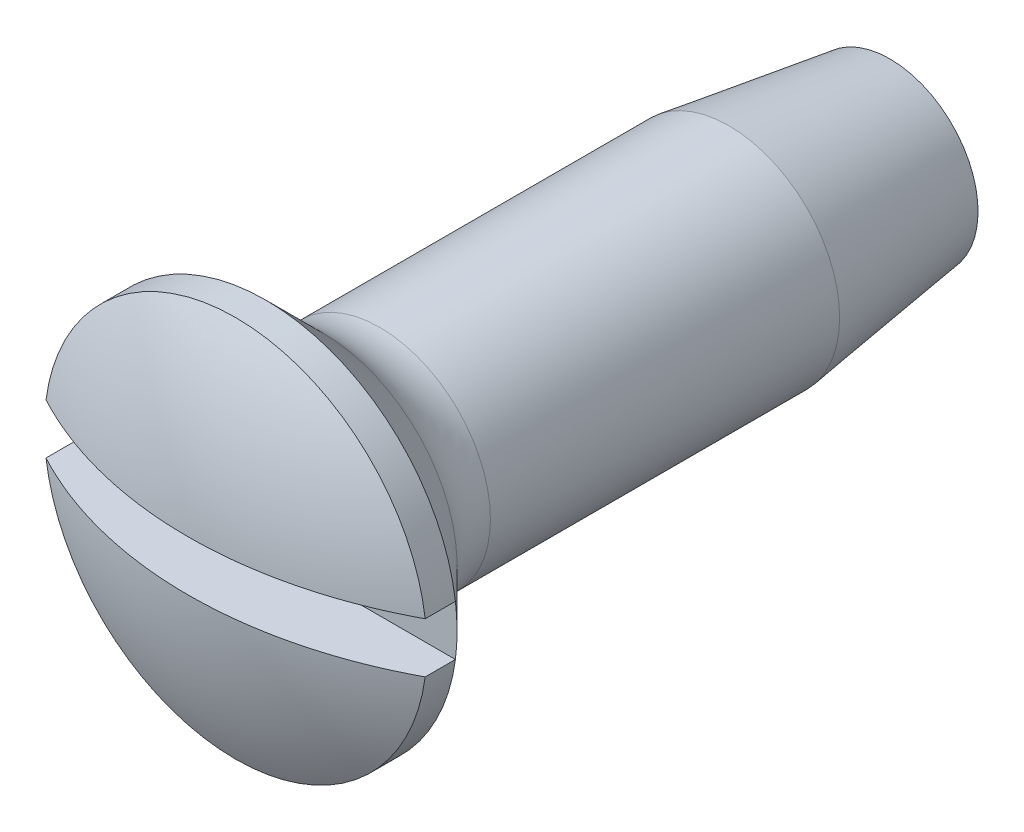
ISO-10303-21;
HEADER;
FILE_DESCRIPTION(('STEP AP214'),'2;1');
FILE_NAME('part.step','',(''),(''),'','','');
FILE_SCHEMA(('AUTOMOTIVE_DESIGN { 1 0 10303 214 1 1 1 1 }'));
ENDSEC;
DATA;
#1=APPLICATION_CONTEXT('core data for automotive mechanical design processes');
#2=APPLICATION_PROTOCOL_DEFINITION('international standard','automotive_design',2000,#1);
#3=PRODUCT_CONTEXT('',#1,'mechanical');
#4=PRODUCT('Part','Part','',(#3));
#5=PRODUCT_RELATED_PRODUCT_CATEGORY('part','',(#4));
#6=PRODUCT_DEFINITION_FORMATION('','',#4);
#7=PRODUCT_DEFINITION_CONTEXT('part definition',#1,'design');
#8=PRODUCT_DEFINITION('design','',#6,#7);
#9=PRODUCT_DEFINITION_SHAPE('','',#8);
#10=(LENGTH_UNIT() NAMED_UNIT(*) SI_UNIT(.MILLI.,.METRE.));
#11=(NAMED_UNIT(*) PLANE_ANGLE_UNIT() SI_UNIT($,.RADIAN.));
#12=(NAMED_UNIT(*) SI_UNIT($,.STERADIAN.) SOLID_ANGLE_UNIT());
#13=UNCERTAINTY_MEASURE_WITH_UNIT(LENGTH_MEASURE(1.E-05),#10,'distance_accuracy_value','');
#14=(GEOMETRIC_REPRESENTATION_CONTEXT(3) GLOBAL_UNCERTAINTY_ASSIGNED_CONTEXT((#13)) GLOBAL_UNIT_ASSIGNED_CONTEXT((#10,
#11,#12)) REPRESENTATION_CONTEXT('',''));
#15=CARTESIAN_POINT('',(0.,0.,0.));
#16=DIRECTION('',(0.,0.,1.));
#17=DIRECTION('',(1.,0.,0.));
#18=AXIS2_PLACEMENT_3D('',#15,#16,#17);
#19=CARTESIAN_POINT('',(0.,0.,2.98005681864039));
#20=DIRECTION('',(0.,0.,-1.));
#21=DIRECTION('',(0.,1.,0.));
#22=AXIS2_PLACEMENT_3D('',#19,#20,#21);
#23=SPHERICAL_SURFACE('',#22,4.);
#24=CARTESIAN_POINT('',(0.,0.25,2.98005681864039));
#25=DIRECTION('',(0.,1.,0.));
#26=DIRECTION('',(0.,0.,1.));
#27=AXIS2_PLACEMENT_3D('',#24,#25,#26);
#28=CIRCLE('',#27,3.99217985566783);
#29=CARTESIAN_POINT('',(1.88348082018373,0.25,6.5));
#30=VERTEX_POINT('',#29);
#31=CARTESIAN_POINT('',(-1.88348082018373,0.249999999999999,6.5));
#32=VERTEX_POINT('',#31);
#33=EDGE_CURVE('E155',#30,#32,#28,.F.);
#34=ORIENTED_EDGE('',*,*,#33,.F.);
#35=CARTESIAN_POINT('',(0.,0.,6.5));
#36=DIRECTION('',(0.,0.,-1.));
#37=DIRECTION('',(0.,1.,0.));
#38=AXIS2_PLACEMENT_3D('',#35,#36,#37);
#39=CIRCLE('',#38,1.89999999999999);
#40=EDGE_CURVE('E108',#32,#30,#39,.T.);
#41=ORIENTED_EDGE('',*,*,#40,.F.);
#42=EDGE_LOOP('',(#34,#41));
#43=FACE_BOUND('',#42,.T.);
#44=ADVANCED_FACE('F34',(#43),#23,.T.);
#45=CARTESIAN_POINT('',(0.,0.,-0.455542036198523));
#46=DIRECTION('',(0.,0.,-1.));
#47=DIRECTION('',(0.,1.,0.));
#48=AXIS2_PLACEMENT_3D('',#45,#46,#47);
#49=CYLINDRICAL_SURFACE('',#48,1.89999999999999);
#50=DIRECTION('',(0.,0.,-1.));
#51=VECTOR('',#50,1.);
#52=CARTESIAN_POINT('',(1.88348082018373,0.25,-0.455542036198523));
#53=LINE('',#52,#51);
#54=CARTESIAN_POINT('',(1.88348082018372,0.25,6.2));
#55=VERTEX_POINT('',#54);
#56=EDGE_CURVE('E56',#55,#30,#53,.F.);
#57=ORIENTED_EDGE('',*,*,#56,.F.);
#58=CARTESIAN_POINT('',(0.,0.,6.2));
#59=DIRECTION('',(0.,0.,-1.));
#60=DIRECTION('',(0.,1.,0.));
#61=AXIS2_PLACEMENT_3D('',#58,#59,#60);
#62=CIRCLE('',#61,1.89999999999999);
#63=CARTESIAN_POINT('',(-1.88348082018373,0.250000000000001,6.2));
#64=VERTEX_POINT('',#63);
#65=EDGE_CURVE('E83',#64,#55,#62,.T.);
#66=ORIENTED_EDGE('',*,*,#65,.F.);
#67=DIRECTION('',(0.,0.,-1.));
#68=VECTOR('',#67,1.);
#69=CARTESIAN_POINT('',(-1.88348082018373,0.25,-0.455542036198523));
#70=LINE('',#69,#68);
#71=EDGE_CURVE('E99',#32,#64,#70,.T.);
#72=ORIENTED_EDGE('',*,*,#71,.F.);
#73=ORIENTED_EDGE('',*,*,#40,.T.);
#74=EDGE_LOOP('',(#57,#66,#72,#73));
#75=FACE_BOUND('',#74,.T.);
#76=ADVANCED_FACE('F133',(#75),#49,.T.);
#77=CARTESIAN_POINT('',(0.,0.,-0.455542036198523));
#78=DIRECTION('',(0.,0.,-1.));
#79=DIRECTION('',(0.,1.,0.));
#80=AXIS2_PLACEMENT_3D('',#77,#78,#79);
#81=CYLINDRICAL_SURFACE('',#80,1.09999999999999);
#82=CARTESIAN_POINT('',(0.,0.,5.06862915010152));
#83=DIRECTION('',(0.,0.,-1.));
#84=DIRECTION('',(0.,1.,0.));
#85=AXIS2_PLACEMENT_3D('',#82,#83,#84);
#86=CIRCLE('',#85,1.09999999999999);
#87=CARTESIAN_POINT('',(0.,1.09999999999999,5.06862915010152));
#88=VERTEX_POINT('',#87);
#89=EDGE_CURVE('E42',#88,#88,#86,.T.);
#90=ORIENTED_EDGE('',*,*,#89,.T.);
#91=EDGE_LOOP('',(#90));
#92=FACE_BOUND('',#91,.T.);
#93=CARTESIAN_POINT('',(0.,0.,1.6));
#94=DIRECTION('',(0.,0.,-1.));
#95=DIRECTION('',(0.,1.,0.));
#96=AXIS2_PLACEMENT_3D('',#93,#94,#95);
#97=CIRCLE('',#96,1.09999999999999);
#98=CARTESIAN_POINT('',(0.,1.09999999999999,1.6));
#99=VERTEX_POINT('',#98);
#100=EDGE_CURVE('E117',#99,#99,#97,.T.);
#101=ORIENTED_EDGE('',*,*,#100,.F.);
#102=EDGE_LOOP('',(#101));
#103=FACE_BOUND('',#102,.T.);
#104=ADVANCED_FACE('F122',(#92,#103),#81,.T.);
#105=CARTESIAN_POINT('',(0.,0.,0.));
#106=DIRECTION('',(0.,0.,1.));
#107=DIRECTION('',(0.,-1.,0.));
#108=AXIS2_PLACEMENT_3D('',#105,#106,#107);
#109=CONICAL_SURFACE('',#108,0.875134664476168,0.139626340159547);
#110=ORIENTED_EDGE('',*,*,#100,.T.);
#111=EDGE_LOOP('',(#110));
#112=FACE_BOUND('',#111,.T.);
#113=CARTESIAN_POINT('',(0.,0.,0.));
#114=DIRECTION('',(0.,0.,-1.));
#115=DIRECTION('',(0.,1.,0.));
#116=AXIS2_PLACEMENT_3D('',#113,#114,#115);
#117=CIRCLE('',#116,0.875134664476168);
#118=CARTESIAN_POINT('',(0.,0.875134664476168,0.));
#119=VERTEX_POINT('',#118);
#120=EDGE_CURVE('E114',#119,#119,#117,.T.);
#121=ORIENTED_EDGE('',*,*,#120,.F.);
#122=EDGE_LOOP('',(#121));
#123=FACE_BOUND('',#122,.T.);
#124=ADVANCED_FACE('F150',(#112,#123),#109,.T.);
#125=CARTESIAN_POINT('',(0.,0.875134664476168,0.));
#126=DIRECTION('',(0.,0.,-1.));
#127=DIRECTION('',(0.,1.,0.));
#128=AXIS2_PLACEMENT_3D('',#125,#126,#127);
#129=PLANE('',#128);
#130=ORIENTED_EDGE('',*,*,#120,.T.);
#131=EDGE_LOOP('',(#130));
#132=FACE_BOUND('',#131,.T.);
#133=ADVANCED_FACE('F144',(#132),#129,.T.);
#134=CARTESIAN_POINT('',(0.,-0.25,2.98005681864039));
#135=DIRECTION('',(0.,-1.,0.));
#136=DIRECTION('',(0.,0.,-1.));
#137=AXIS2_PLACEMENT_3D('',#134,#135,#136);
#138=CIRCLE('',#137,3.99217985566783);
#139=CARTESIAN_POINT('',(-1.88348082018373,-0.25,6.5));
#140=VERTEX_POINT('',#139);
#141=CARTESIAN_POINT('',(1.88348082018373,-0.250000000000001,6.5));
#142=VERTEX_POINT('',#141);
#143=EDGE_CURVE('E100',#140,#142,#138,.F.);
#144=ORIENTED_EDGE('',*,*,#143,.F.);
#145=EDGE_CURVE('E98',#142,#140,#39,.T.);
#146=ORIENTED_EDGE('',*,*,#145,.F.);
#147=EDGE_LOOP('',(#144,#146));
#148=FACE_BOUND('',#147,.T.);
#149=ADVANCED_FACE('F136',(#148),#23,.T.);
#150=DIRECTION('',(0.,0.,-1.));
#151=VECTOR('',#150,1.);
#152=CARTESIAN_POINT('',(-1.88348082018373,-0.25,-0.455542036198523));
#153=LINE('',#152,#151);
#154=CARTESIAN_POINT('',(-1.88348082018372,-0.25,6.2));
#155=VERTEX_POINT('',#154);
#156=EDGE_CURVE('E88',#155,#140,#153,.F.);
#157=ORIENTED_EDGE('',*,*,#156,.F.);
#158=CARTESIAN_POINT('',(1.88348082018372,-0.25,6.2));
#159=VERTEX_POINT('',#158);
#160=EDGE_CURVE('E82',#159,#155,#62,.T.);
#161=ORIENTED_EDGE('',*,*,#160,.F.);
#162=DIRECTION('',(0.,0.,-1.));
#163=VECTOR('',#162,1.);
#164=CARTESIAN_POINT('',(1.88348082018373,-0.25,-0.455542036198523));
#165=LINE('',#164,#163);
#166=EDGE_CURVE('E91',#142,#159,#165,.T.);
#167=ORIENTED_EDGE('',*,*,#166,.F.);
#168=ORIENTED_EDGE('',*,*,#145,.T.);
#169=EDGE_LOOP('',(#157,#161,#167,#168));
#170=FACE_BOUND('',#169,.T.);
#171=ADVANCED_FACE('F95',(#170),#49,.T.);
#172=CARTESIAN_POINT('',(0.,0.,5.4));
#173=DIRECTION('',(0.,0.,1.));
#174=DIRECTION('',(0.,-1.,0.));
#175=AXIS2_PLACEMENT_3D('',#172,#173,#174);
#176=CONICAL_SURFACE('',#175,1.09999999999999,0.785398163397442);
#177=CARTESIAN_POINT('',(0.,0.,5.63431457505076));
#178=DIRECTION('',(0.,0.,1.));
#179=DIRECTION('',(0.,-1.,0.));
#180=AXIS2_PLACEMENT_3D('',#177,#178,#179);
#181=CIRCLE('',#180,1.33431457505075);
#182=CARTESIAN_POINT('',(0.,-1.33431457505076,5.63431457505076));
#183=VERTEX_POINT('',#182);
#184=EDGE_CURVE('E11',#183,#183,#181,.T.);
#185=ORIENTED_EDGE('',*,*,#184,.T.);
#186=EDGE_LOOP('',(#185));
#187=FACE_BOUND('',#186,.T.);
#188=EDGE_CURVE('E103',#55,#159,#62,.T.);
#189=ORIENTED_EDGE('',*,*,#188,.T.);
#190=ORIENTED_EDGE('',*,*,#160,.T.);
#191=EDGE_CURVE('E74',#155,#64,#62,.T.);
#192=ORIENTED_EDGE('',*,*,#191,.T.);
#193=ORIENTED_EDGE('',*,*,#65,.T.);
#194=EDGE_LOOP('',(#189,#190,#192,#193));
#195=FACE_BOUND('',#194,.T.);
#196=ADVANCED_FACE('F102',(#187,#195),#176,.T.);
#197=CARTESIAN_POINT('',(-50.,0.25,7.));
#198=DIRECTION('',(0.,1.,0.));
#199=DIRECTION('',(0.,0.,1.));
#200=AXIS2_PLACEMENT_3D('',#197,#198,#199);
#201=PLANE('',#200);
#202=ORIENTED_EDGE('',*,*,#56,.T.);
#203=ORIENTED_EDGE('',*,*,#33,.T.);
#204=ORIENTED_EDGE('',*,*,#71,.T.);
#205=DIRECTION('',(1.,0.,0.));
#206=VECTOR('',#205,1.);
#207=CARTESIAN_POINT('',(-50.,0.25,6.2));
#208=LINE('',#207,#206);
#209=EDGE_CURVE('E49',#64,#55,#208,.T.);
#210=ORIENTED_EDGE('',*,*,#209,.T.);
#211=EDGE_LOOP('',(#202,#203,#204,#210));
#212=FACE_BOUND('',#211,.T.);
#213=ADVANCED_FACE('F160',(#212),#201,.F.);
#214=CARTESIAN_POINT('',(-50.,0.25,6.2));
#215=DIRECTION('',(0.,0.,-1.));
#216=DIRECTION('',(-1.,0.,0.));
#217=AXIS2_PLACEMENT_3D('',#214,#215,#216);
#218=PLANE('',#217);
#219=ORIENTED_EDGE('',*,*,#188,.F.);
#220=ORIENTED_EDGE('',*,*,#209,.F.);
#221=ORIENTED_EDGE('',*,*,#191,.F.);
#222=DIRECTION('',(1.,0.,0.));
#223=VECTOR('',#222,1.);
#224=CARTESIAN_POINT('',(-50.,-0.25,6.2));
#225=LINE('',#224,#223);
#226=EDGE_CURVE('E77',#155,#159,#225,.T.);
#227=ORIENTED_EDGE('',*,*,#226,.T.);
#228=EDGE_LOOP('',(#219,#220,#221,#227));
#229=FACE_BOUND('',#228,.T.);
#230=ADVANCED_FACE('F76',(#229),#218,.F.);
#231=CARTESIAN_POINT('',(-50.,-0.25,7.));
#232=DIRECTION('',(0.,-1.,0.));
#233=DIRECTION('',(0.,0.,-1.));
#234=AXIS2_PLACEMENT_3D('',#231,#232,#233);
#235=PLANE('',#234);
#236=ORIENTED_EDGE('',*,*,#156,.T.);
#237=ORIENTED_EDGE('',*,*,#143,.T.);
#238=ORIENTED_EDGE('',*,*,#166,.T.);
#239=ORIENTED_EDGE('',*,*,#226,.F.);
#240=EDGE_LOOP('',(#236,#237,#238,#239));
#241=FACE_BOUND('',#240,.T.);
#242=ADVANCED_FACE('F87',(#241),#235,.F.);
#243=CARTESIAN_POINT('',(0.,0.,5.06862915010152));
#244=DIRECTION('',(0.,0.,-1.));
#245=DIRECTION('',(0.,1.,0.));
#246=AXIS2_PLACEMENT_3D('',#243,#244,#245);
#247=TOROIDAL_SURFACE('',#246,1.89999999999999,0.8);
#248=ORIENTED_EDGE('',*,*,#184,.F.);
#249=EDGE_LOOP('',(#248));
#250=FACE_BOUND('',#249,.T.);
#251=ORIENTED_EDGE('',*,*,#89,.F.);
#252=EDGE_LOOP('',(#251));
#253=FACE_BOUND('',#252,.T.);
#254=ADVANCED_FACE('F36',(#250,#253),#247,.F.);
#255=CLOSED_SHELL('',(#44,#76,#104,#124,#133,#149,#171,#196,#213,#230,#242,#254));
#256=MANIFOLD_SOLID_BREP('B2',#255);
#257=ADVANCED_BREP_SHAPE_REPRESENTATION('',(#18,#256),#14);
#258=SHAPE_DEFINITION_REPRESENTATION(#9,#257);
ENDSEC;
END-ISO-10303-21;
